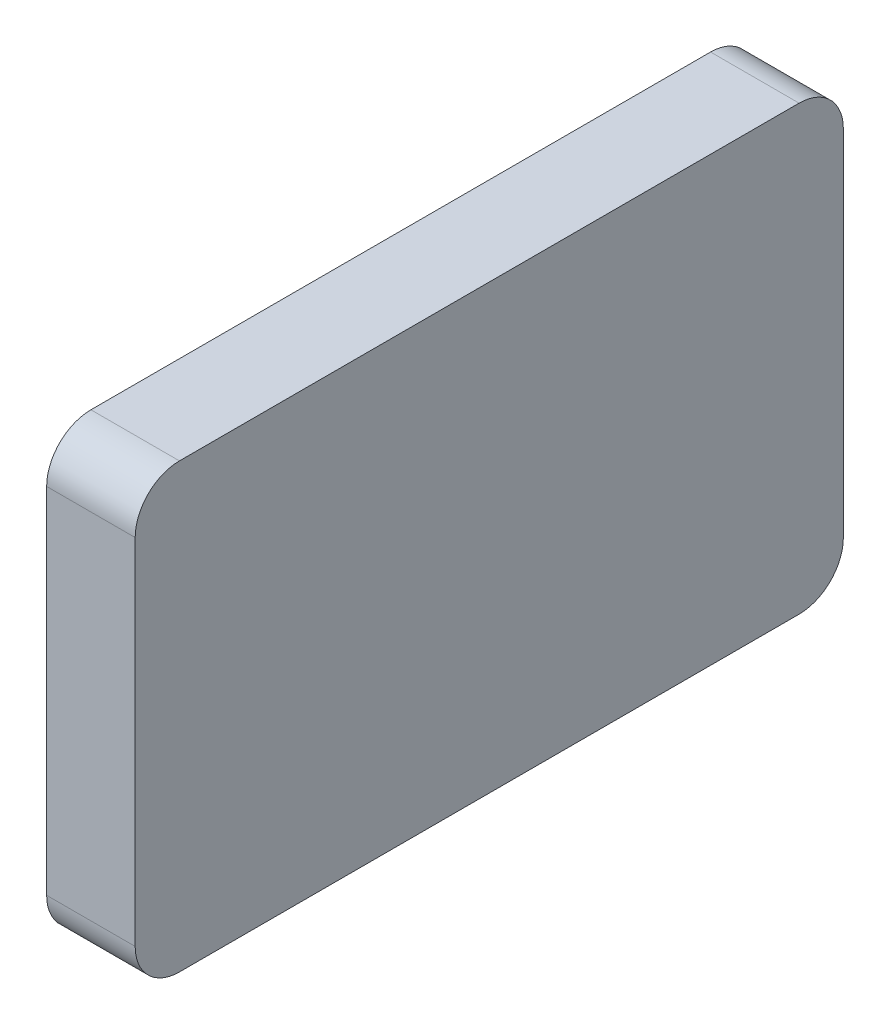
ISO-10303-21;
HEADER;
FILE_DESCRIPTION(('STEP AP214'),'2;1');
FILE_NAME('part.step','',(''),(''),'','','');
FILE_SCHEMA(('AUTOMOTIVE_DESIGN { 1 0 10303 214 1 1 1 1 }'));
ENDSEC;
DATA;
#1=APPLICATION_CONTEXT('core data for automotive mechanical design processes');
#2=APPLICATION_PROTOCOL_DEFINITION('international standard','automotive_design',2000,#1);
#3=PRODUCT_CONTEXT('',#1,'mechanical');
#4=PRODUCT('Part','Part','',(#3));
#5=PRODUCT_RELATED_PRODUCT_CATEGORY('part','',(#4));
#6=PRODUCT_DEFINITION_FORMATION('','',#4);
#7=PRODUCT_DEFINITION_CONTEXT('part definition',#1,'design');
#8=PRODUCT_DEFINITION('design','',#6,#7);
#9=PRODUCT_DEFINITION_SHAPE('','',#8);
#10=(LENGTH_UNIT() NAMED_UNIT(*) SI_UNIT(.MILLI.,.METRE.));
#11=(NAMED_UNIT(*) PLANE_ANGLE_UNIT() SI_UNIT($,.RADIAN.));
#12=(NAMED_UNIT(*) SI_UNIT($,.STERADIAN.) SOLID_ANGLE_UNIT());
#13=UNCERTAINTY_MEASURE_WITH_UNIT(LENGTH_MEASURE(1.E-05),#10,'distance_accuracy_value','');
#14=(GEOMETRIC_REPRESENTATION_CONTEXT(3) GLOBAL_UNCERTAINTY_ASSIGNED_CONTEXT((#13)) GLOBAL_UNIT_ASSIGNED_CONTEXT((#10,
#11,#12)) REPRESENTATION_CONTEXT('',''));
#15=CARTESIAN_POINT('',(0.,0.,0.));
#16=DIRECTION('',(0.,0.,1.));
#17=DIRECTION('',(1.,0.,0.));
#18=AXIS2_PLACEMENT_3D('',#15,#16,#17);
#19=CARTESIAN_POINT('',(0.5,2.5,-4.));
#20=DIRECTION('',(0.,0.,1.));
#21=DIRECTION('',(0.,-1.,0.));
#22=AXIS2_PLACEMENT_3D('',#19,#20,#21);
#23=PLANE('',#22);
#24=DIRECTION('',(0.,1.,0.));
#25=VECTOR('',#24,1.);
#26=CARTESIAN_POINT('',(0.5,2.5,-4.));
#27=LINE('',#26,#25);
#28=CARTESIAN_POINT('',(0.5,-2.,-4.));
#29=VERTEX_POINT('',#28);
#30=CARTESIAN_POINT('',(0.5,2.,-4.));
#31=VERTEX_POINT('',#30);
#32=EDGE_CURVE('E117',#29,#31,#27,.T.);
#33=ORIENTED_EDGE('',*,*,#32,.F.);
#34=DIRECTION('',(-1.,0.,0.));
#35=VECTOR('',#34,1.);
#36=CARTESIAN_POINT('',(0.5,-2.,-4.));
#37=LINE('',#36,#35);
#38=CARTESIAN_POINT('',(-0.5,-2.,-4.));
#39=VERTEX_POINT('',#38);
#40=EDGE_CURVE('E102',#29,#39,#37,.T.);
#41=ORIENTED_EDGE('',*,*,#40,.T.);
#42=DIRECTION('',(0.,1.,0.));
#43=VECTOR('',#42,1.);
#44=CARTESIAN_POINT('',(-0.5,2.5,-4.));
#45=LINE('',#44,#43);
#46=CARTESIAN_POINT('',(-0.5,2.,-4.));
#47=VERTEX_POINT('',#46);
#48=EDGE_CURVE('E114',#39,#47,#45,.T.);
#49=ORIENTED_EDGE('',*,*,#48,.T.);
#50=DIRECTION('',(-1.,0.,0.));
#51=VECTOR('',#50,1.);
#52=CARTESIAN_POINT('',(0.5,2.,-4.));
#53=LINE('',#52,#51);
#54=EDGE_CURVE('E119',#47,#31,#53,.F.);
#55=ORIENTED_EDGE('',*,*,#54,.T.);
#56=EDGE_LOOP('',(#33,#41,#49,#55));
#57=FACE_BOUND('',#56,.T.);
#58=ADVANCED_FACE('F32',(#57),#23,.F.);
#59=CARTESIAN_POINT('',(0.5,2.5,4.));
#60=DIRECTION('',(0.,-1.,0.));
#61=DIRECTION('',(0.,0.,-1.));
#62=AXIS2_PLACEMENT_3D('',#59,#60,#61);
#63=PLANE('',#62);
#64=DIRECTION('',(0.,0.,1.));
#65=VECTOR('',#64,1.);
#66=CARTESIAN_POINT('',(-0.5,2.5,4.));
#67=LINE('',#66,#65);
#68=CARTESIAN_POINT('',(-0.5,2.5,-3.5));
#69=VERTEX_POINT('',#68);
#70=CARTESIAN_POINT('',(-0.5,2.5,3.5));
#71=VERTEX_POINT('',#70);
#72=EDGE_CURVE('E123',#69,#71,#67,.T.);
#73=ORIENTED_EDGE('',*,*,#72,.T.);
#74=DIRECTION('',(-1.,0.,0.));
#75=VECTOR('',#74,1.);
#76=CARTESIAN_POINT('',(0.5,2.5,3.5));
#77=LINE('',#76,#75);
#78=CARTESIAN_POINT('',(0.5,2.5,3.5));
#79=VERTEX_POINT('',#78);
#80=EDGE_CURVE('E11',#71,#79,#77,.F.);
#81=ORIENTED_EDGE('',*,*,#80,.T.);
#82=DIRECTION('',(0.,0.,1.));
#83=VECTOR('',#82,1.);
#84=CARTESIAN_POINT('',(0.5,2.5,4.));
#85=LINE('',#84,#83);
#86=CARTESIAN_POINT('',(0.5,2.5,-3.5));
#87=VERTEX_POINT('',#86);
#88=EDGE_CURVE('E159',#87,#79,#85,.T.);
#89=ORIENTED_EDGE('',*,*,#88,.F.);
#90=DIRECTION('',(-1.,0.,0.));
#91=VECTOR('',#90,1.);
#92=CARTESIAN_POINT('',(0.5,2.5,-3.5));
#93=LINE('',#92,#91);
#94=EDGE_CURVE('E40',#87,#69,#93,.T.);
#95=ORIENTED_EDGE('',*,*,#94,.T.);
#96=EDGE_LOOP('',(#73,#81,#89,#95));
#97=FACE_BOUND('',#96,.T.);
#98=ADVANCED_FACE('F157',(#97),#63,.F.);
#99=CARTESIAN_POINT('',(0.5,2.5,4.));
#100=DIRECTION('',(0.,0.,-1.));
#101=DIRECTION('',(0.,1.,0.));
#102=AXIS2_PLACEMENT_3D('',#99,#100,#101);
#103=PLANE('',#102);
#104=DIRECTION('',(0.,-1.,0.));
#105=VECTOR('',#104,1.);
#106=CARTESIAN_POINT('',(-0.5,2.5,4.));
#107=LINE('',#106,#105);
#108=CARTESIAN_POINT('',(-0.5,2.,4.));
#109=VERTEX_POINT('',#108);
#110=CARTESIAN_POINT('',(-0.5,-2.,4.));
#111=VERTEX_POINT('',#110);
#112=EDGE_CURVE('E126',#109,#111,#107,.T.);
#113=ORIENTED_EDGE('',*,*,#112,.T.);
#114=DIRECTION('',(-1.,0.,0.));
#115=VECTOR('',#114,1.);
#116=CARTESIAN_POINT('',(0.5,-2.,4.));
#117=LINE('',#116,#115);
#118=CARTESIAN_POINT('',(0.5,-2.,4.));
#119=VERTEX_POINT('',#118);
#120=EDGE_CURVE('E47',#111,#119,#117,.F.);
#121=ORIENTED_EDGE('',*,*,#120,.T.);
#122=DIRECTION('',(0.,-1.,0.));
#123=VECTOR('',#122,1.);
#124=CARTESIAN_POINT('',(0.5,2.5,4.));
#125=LINE('',#124,#123);
#126=CARTESIAN_POINT('',(0.5,2.,4.));
#127=VERTEX_POINT('',#126);
#128=EDGE_CURVE('E167',#127,#119,#125,.T.);
#129=ORIENTED_EDGE('',*,*,#128,.F.);
#130=DIRECTION('',(-1.,0.,0.));
#131=VECTOR('',#130,1.);
#132=CARTESIAN_POINT('',(0.5,2.,4.));
#133=LINE('',#132,#131);
#134=EDGE_CURVE('E150',#127,#109,#133,.T.);
#135=ORIENTED_EDGE('',*,*,#134,.T.);
#136=EDGE_LOOP('',(#113,#121,#129,#135));
#137=FACE_BOUND('',#136,.T.);
#138=ADVANCED_FACE('F166',(#137),#103,.F.);
#139=CARTESIAN_POINT('',(0.5,-2.5,4.));
#140=DIRECTION('',(0.,1.,0.));
#141=DIRECTION('',(0.,0.,1.));
#142=AXIS2_PLACEMENT_3D('',#139,#140,#141);
#143=PLANE('',#142);
#144=DIRECTION('',(0.,0.,-1.));
#145=VECTOR('',#144,1.);
#146=CARTESIAN_POINT('',(-0.5,-2.5,4.));
#147=LINE('',#146,#145);
#148=CARTESIAN_POINT('',(-0.5,-2.5,3.5));
#149=VERTEX_POINT('',#148);
#150=CARTESIAN_POINT('',(-0.5,-2.5,-3.5));
#151=VERTEX_POINT('',#150);
#152=EDGE_CURVE('E133',#149,#151,#147,.T.);
#153=ORIENTED_EDGE('',*,*,#152,.T.);
#154=DIRECTION('',(-1.,0.,0.));
#155=VECTOR('',#154,1.);
#156=CARTESIAN_POINT('',(0.5,-2.5,-3.5));
#157=LINE('',#156,#155);
#158=CARTESIAN_POINT('',(0.5,-2.5,-3.5));
#159=VERTEX_POINT('',#158);
#160=EDGE_CURVE('E103',#151,#159,#157,.F.);
#161=ORIENTED_EDGE('',*,*,#160,.T.);
#162=DIRECTION('',(0.,0.,-1.));
#163=VECTOR('',#162,1.);
#164=CARTESIAN_POINT('',(0.5,-2.5,4.));
#165=LINE('',#164,#163);
#166=CARTESIAN_POINT('',(0.5,-2.5,3.5));
#167=VERTEX_POINT('',#166);
#168=EDGE_CURVE('E129',#167,#159,#165,.T.);
#169=ORIENTED_EDGE('',*,*,#168,.F.);
#170=DIRECTION('',(-1.,0.,0.));
#171=VECTOR('',#170,1.);
#172=CARTESIAN_POINT('',(0.5,-2.5,3.5));
#173=LINE('',#172,#171);
#174=EDGE_CURVE('E108',#167,#149,#173,.T.);
#175=ORIENTED_EDGE('',*,*,#174,.T.);
#176=EDGE_LOOP('',(#153,#161,#169,#175));
#177=FACE_BOUND('',#176,.T.);
#178=ADVANCED_FACE('F195',(#177),#143,.F.);
#179=CARTESIAN_POINT('',(0.5,0.,0.));
#180=DIRECTION('',(1.,0.,0.));
#181=DIRECTION('',(0.,0.,-1.));
#182=AXIS2_PLACEMENT_3D('',#179,#180,#181);
#183=PLANE('',#182);
#184=ORIENTED_EDGE('',*,*,#168,.T.);
#185=CARTESIAN_POINT('',(0.5,-2.,-3.5));
#186=DIRECTION('',(1.,0.,0.));
#187=DIRECTION('',(0.,0.,-1.));
#188=AXIS2_PLACEMENT_3D('',#185,#186,#187);
#189=CIRCLE('',#188,0.5);
#190=EDGE_CURVE('E148',#159,#29,#189,.T.);
#191=ORIENTED_EDGE('',*,*,#190,.T.);
#192=ORIENTED_EDGE('',*,*,#32,.T.);
#193=CARTESIAN_POINT('',(0.5,2.,-3.5));
#194=DIRECTION('',(1.,0.,0.));
#195=DIRECTION('',(0.,0.,-1.));
#196=AXIS2_PLACEMENT_3D('',#193,#194,#195);
#197=CIRCLE('',#196,0.5);
#198=EDGE_CURVE('E143',#31,#87,#197,.T.);
#199=ORIENTED_EDGE('',*,*,#198,.T.);
#200=ORIENTED_EDGE('',*,*,#88,.T.);
#201=CARTESIAN_POINT('',(0.5,2.,3.5));
#202=DIRECTION('',(1.,0.,0.));
#203=DIRECTION('',(0.,0.,-1.));
#204=AXIS2_PLACEMENT_3D('',#201,#202,#203);
#205=CIRCLE('',#204,0.5);
#206=EDGE_CURVE('E54',#79,#127,#205,.T.);
#207=ORIENTED_EDGE('',*,*,#206,.T.);
#208=ORIENTED_EDGE('',*,*,#128,.T.);
#209=CARTESIAN_POINT('',(0.5,-2.,3.5));
#210=DIRECTION('',(1.,0.,0.));
#211=DIRECTION('',(0.,0.,-1.));
#212=AXIS2_PLACEMENT_3D('',#209,#210,#211);
#213=CIRCLE('',#212,0.5);
#214=EDGE_CURVE('E146',#119,#167,#213,.T.);
#215=ORIENTED_EDGE('',*,*,#214,.T.);
#216=EDGE_LOOP('',(#184,#191,#192,#199,#200,#207,#208,#215));
#217=FACE_BOUND('',#216,.T.);
#218=ADVANCED_FACE('F172',(#217),#183,.T.);
#219=CARTESIAN_POINT('',(-0.5,0.,0.));
#220=DIRECTION('',(1.,0.,0.));
#221=DIRECTION('',(0.,0.,-1.));
#222=AXIS2_PLACEMENT_3D('',#219,#220,#221);
#223=PLANE('',#222);
#224=ORIENTED_EDGE('',*,*,#48,.F.);
#225=CARTESIAN_POINT('',(-0.5,-2.,-3.5));
#226=DIRECTION('',(1.,0.,0.));
#227=DIRECTION('',(0.,0.,-1.));
#228=AXIS2_PLACEMENT_3D('',#225,#226,#227);
#229=CIRCLE('',#228,0.5);
#230=EDGE_CURVE('E98',#39,#151,#229,.F.);
#231=ORIENTED_EDGE('',*,*,#230,.T.);
#232=ORIENTED_EDGE('',*,*,#152,.F.);
#233=CARTESIAN_POINT('',(-0.5,-2.,3.5));
#234=DIRECTION('',(1.,0.,0.));
#235=DIRECTION('',(0.,0.,-1.));
#236=AXIS2_PLACEMENT_3D('',#233,#234,#235);
#237=CIRCLE('',#236,0.5);
#238=EDGE_CURVE('E109',#149,#111,#237,.F.);
#239=ORIENTED_EDGE('',*,*,#238,.T.);
#240=ORIENTED_EDGE('',*,*,#112,.F.);
#241=CARTESIAN_POINT('',(-0.5,2.,3.5));
#242=DIRECTION('',(1.,0.,0.));
#243=DIRECTION('',(0.,0.,-1.));
#244=AXIS2_PLACEMENT_3D('',#241,#242,#243);
#245=CIRCLE('',#244,0.5);
#246=EDGE_CURVE('E137',#109,#71,#245,.F.);
#247=ORIENTED_EDGE('',*,*,#246,.T.);
#248=ORIENTED_EDGE('',*,*,#72,.F.);
#249=CARTESIAN_POINT('',(-0.5,2.,-3.5));
#250=DIRECTION('',(1.,0.,0.));
#251=DIRECTION('',(0.,0.,-1.));
#252=AXIS2_PLACEMENT_3D('',#249,#250,#251);
#253=CIRCLE('',#252,0.5);
#254=EDGE_CURVE('E118',#69,#47,#253,.F.);
#255=ORIENTED_EDGE('',*,*,#254,.T.);
#256=EDGE_LOOP('',(#224,#231,#232,#239,#240,#247,#248,#255));
#257=FACE_BOUND('',#256,.T.);
#258=ADVANCED_FACE('F121',(#257),#223,.F.);
#259=CARTESIAN_POINT('',(0.5,-2.,-3.5));
#260=DIRECTION('',(-1.,0.,0.));
#261=DIRECTION('',(0.,0.,1.));
#262=AXIS2_PLACEMENT_3D('',#259,#260,#261);
#263=CYLINDRICAL_SURFACE('',#262,0.5);
#264=ORIENTED_EDGE('',*,*,#190,.F.);
#265=ORIENTED_EDGE('',*,*,#160,.F.);
#266=ORIENTED_EDGE('',*,*,#230,.F.);
#267=ORIENTED_EDGE('',*,*,#40,.F.);
#268=EDGE_LOOP('',(#264,#265,#266,#267));
#269=FACE_BOUND('',#268,.T.);
#270=ADVANCED_FACE('F101',(#269),#263,.T.);
#271=CARTESIAN_POINT('',(0.5,-2.,3.5));
#272=DIRECTION('',(-1.,0.,0.));
#273=DIRECTION('',(0.,0.,1.));
#274=AXIS2_PLACEMENT_3D('',#271,#272,#273);
#275=CYLINDRICAL_SURFACE('',#274,0.5);
#276=ORIENTED_EDGE('',*,*,#214,.F.);
#277=ORIENTED_EDGE('',*,*,#120,.F.);
#278=ORIENTED_EDGE('',*,*,#238,.F.);
#279=ORIENTED_EDGE('',*,*,#174,.F.);
#280=EDGE_LOOP('',(#276,#277,#278,#279));
#281=FACE_BOUND('',#280,.T.);
#282=ADVANCED_FACE('F177',(#281),#275,.T.);
#283=CARTESIAN_POINT('',(0.5,2.,3.5));
#284=DIRECTION('',(-1.,0.,0.));
#285=DIRECTION('',(0.,0.,1.));
#286=AXIS2_PLACEMENT_3D('',#283,#284,#285);
#287=CYLINDRICAL_SURFACE('',#286,0.5);
#288=ORIENTED_EDGE('',*,*,#206,.F.);
#289=ORIENTED_EDGE('',*,*,#80,.F.);
#290=ORIENTED_EDGE('',*,*,#246,.F.);
#291=ORIENTED_EDGE('',*,*,#134,.F.);
#292=EDGE_LOOP('',(#288,#289,#290,#291));
#293=FACE_BOUND('',#292,.T.);
#294=ADVANCED_FACE('F165',(#293),#287,.T.);
#295=CARTESIAN_POINT('',(0.5,2.,-3.5));
#296=DIRECTION('',(-1.,0.,0.));
#297=DIRECTION('',(0.,0.,1.));
#298=AXIS2_PLACEMENT_3D('',#295,#296,#297);
#299=CYLINDRICAL_SURFACE('',#298,0.5);
#300=ORIENTED_EDGE('',*,*,#198,.F.);
#301=ORIENTED_EDGE('',*,*,#54,.F.);
#302=ORIENTED_EDGE('',*,*,#254,.F.);
#303=ORIENTED_EDGE('',*,*,#94,.F.);
#304=EDGE_LOOP('',(#300,#301,#302,#303));
#305=FACE_BOUND('',#304,.T.);
#306=ADVANCED_FACE('F34',(#305),#299,.T.);
#307=CLOSED_SHELL('',(#58,#98,#138,#178,#218,#258,#270,#282,#294,#306));
#308=MANIFOLD_SOLID_BREP('B2',#307);
#309=ADVANCED_BREP_SHAPE_REPRESENTATION('',(#18,#308),#14);
#310=SHAPE_DEFINITION_REPRESENTATION(#9,#309);
ENDSEC;
END-ISO-10303-21;
